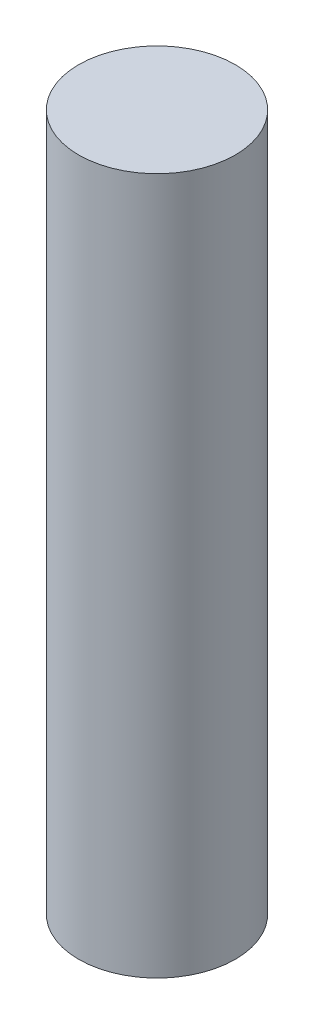
ISO-10303-21;
HEADER;
FILE_DESCRIPTION(('STEP AP214'),'2;1');
FILE_NAME('part.step','',(''),(''),'','','');
FILE_SCHEMA(('AUTOMOTIVE_DESIGN { 1 0 10303 214 1 1 1 1 }'));
ENDSEC;
DATA;
#1=APPLICATION_CONTEXT('core data for automotive mechanical design processes');
#2=APPLICATION_PROTOCOL_DEFINITION('international standard','automotive_design',2000,#1);
#3=PRODUCT_CONTEXT('',#1,'mechanical');
#4=PRODUCT('Part','Part','',(#3));
#5=PRODUCT_RELATED_PRODUCT_CATEGORY('part','',(#4));
#6=PRODUCT_DEFINITION_FORMATION('','',#4);
#7=PRODUCT_DEFINITION_CONTEXT('part definition',#1,'design');
#8=PRODUCT_DEFINITION('design','',#6,#7);
#9=PRODUCT_DEFINITION_SHAPE('','',#8);
#10=(LENGTH_UNIT() NAMED_UNIT(*) SI_UNIT(.MILLI.,.METRE.));
#11=(NAMED_UNIT(*) PLANE_ANGLE_UNIT() SI_UNIT($,.RADIAN.));
#12=(NAMED_UNIT(*) SI_UNIT($,.STERADIAN.) SOLID_ANGLE_UNIT());
#13=UNCERTAINTY_MEASURE_WITH_UNIT(LENGTH_MEASURE(1.E-05),#10,'distance_accuracy_value','');
#14=(GEOMETRIC_REPRESENTATION_CONTEXT(3) GLOBAL_UNCERTAINTY_ASSIGNED_CONTEXT((#13)) GLOBAL_UNIT_ASSIGNED_CONTEXT((#10,
#11,#12)) REPRESENTATION_CONTEXT('',''));
#15=CARTESIAN_POINT('',(0.,0.,0.));
#16=DIRECTION('',(0.,0.,1.));
#17=DIRECTION('',(1.,0.,0.));
#18=AXIS2_PLACEMENT_3D('',#15,#16,#17);
#19=CARTESIAN_POINT('',(0.,113.,0.));
#20=DIRECTION('',(0.,-1.,0.));
#21=DIRECTION('',(0.,0.,-1.));
#22=AXIS2_PLACEMENT_3D('',#19,#20,#21);
#23=CYLINDRICAL_SURFACE('',#22,12.7);
#24=CARTESIAN_POINT('',(0.,113.,0.));
#25=DIRECTION('',(0.,1.,0.));
#26=DIRECTION('',(0.,0.,1.));
#27=AXIS2_PLACEMENT_3D('',#24,#25,#26);
#28=CIRCLE('',#27,12.7);
#29=CARTESIAN_POINT('',(0.,113.,12.7));
#30=VERTEX_POINT('',#29);
#31=EDGE_CURVE('E10',#30,#30,#28,.T.);
#32=ORIENTED_EDGE('',*,*,#31,.F.);
#33=EDGE_LOOP('',(#32));
#34=FACE_BOUND('',#33,.T.);
#35=CARTESIAN_POINT('',(0.,0.,0.));
#36=DIRECTION('',(0.,1.,0.));
#37=DIRECTION('',(0.,0.,1.));
#38=AXIS2_PLACEMENT_3D('',#35,#36,#37);
#39=CIRCLE('',#38,12.7);
#40=CARTESIAN_POINT('',(0.,0.,12.7));
#41=VERTEX_POINT('',#40);
#42=EDGE_CURVE('E44',#41,#41,#39,.T.);
#43=ORIENTED_EDGE('',*,*,#42,.T.);
#44=EDGE_LOOP('',(#43));
#45=FACE_BOUND('',#44,.T.);
#46=ADVANCED_FACE('F41',(#34,#45),#23,.T.);
#47=CARTESIAN_POINT('',(0.,113.,0.));
#48=DIRECTION('',(0.,1.,0.));
#49=DIRECTION('',(0.,0.,1.));
#50=AXIS2_PLACEMENT_3D('',#47,#48,#49);
#51=PLANE('',#50);
#52=ORIENTED_EDGE('',*,*,#31,.T.);
#53=EDGE_LOOP('',(#52));
#54=FACE_BOUND('',#53,.T.);
#55=ADVANCED_FACE('F56',(#54),#51,.T.);
#56=CARTESIAN_POINT('',(0.,0.,0.));
#57=DIRECTION('',(0.,1.,0.));
#58=DIRECTION('',(0.,0.,1.));
#59=AXIS2_PLACEMENT_3D('',#56,#57,#58);
#60=PLANE('',#59);
#61=ORIENTED_EDGE('',*,*,#42,.F.);
#62=EDGE_LOOP('',(#61));
#63=FACE_BOUND('',#62,.T.);
#64=ADVANCED_FACE('F54',(#63),#60,.F.);
#65=CLOSED_SHELL('',(#46,#55,#64));
#66=MANIFOLD_SOLID_BREP('B2',#65);
#67=ADVANCED_BREP_SHAPE_REPRESENTATION('',(#18,#66),#14);
#68=SHAPE_DEFINITION_REPRESENTATION(#9,#67);
ENDSEC;
END-ISO-10303-21;
